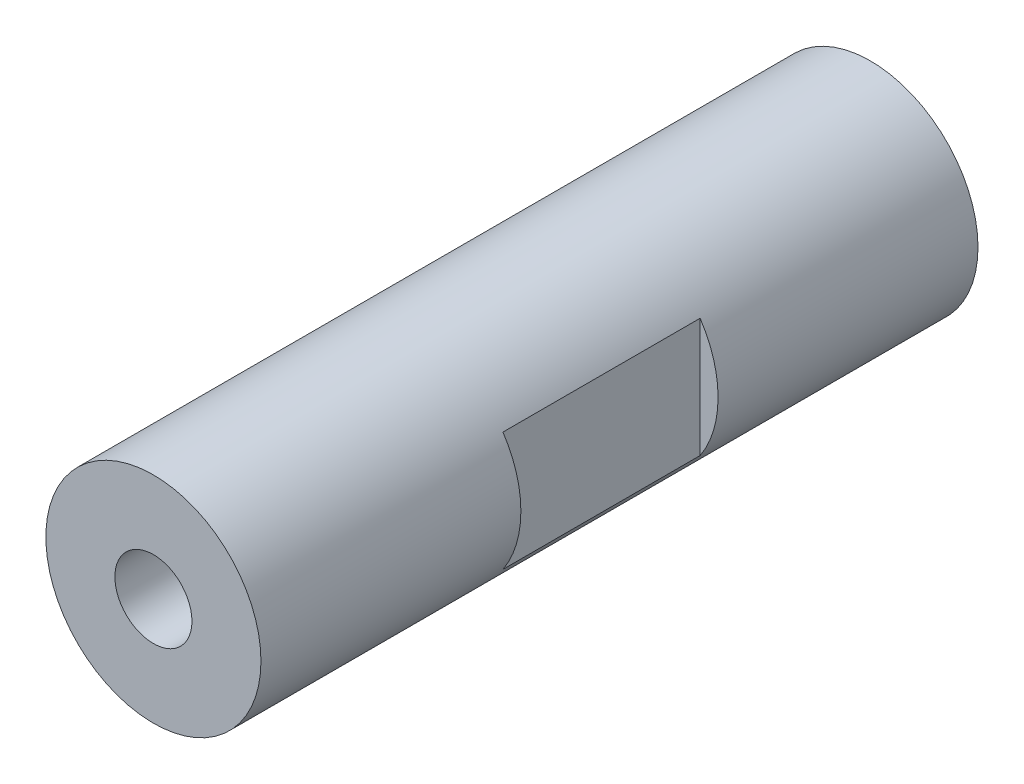
ISO-10303-21;
HEADER;
FILE_DESCRIPTION(('STEP AP214'),'2;1');
FILE_NAME('part.step','',(''),(''),'','','');
FILE_SCHEMA(('AUTOMOTIVE_DESIGN { 1 0 10303 214 1 1 1 1 }'));
ENDSEC;
DATA;
#1=APPLICATION_CONTEXT('core data for automotive mechanical design processes');
#2=APPLICATION_PROTOCOL_DEFINITION('international standard','automotive_design',2000,#1);
#3=PRODUCT_CONTEXT('',#1,'mechanical');
#4=PRODUCT('Part','Part','',(#3));
#5=PRODUCT_RELATED_PRODUCT_CATEGORY('part','',(#4));
#6=PRODUCT_DEFINITION_FORMATION('','',#4);
#7=PRODUCT_DEFINITION_CONTEXT('part definition',#1,'design');
#8=PRODUCT_DEFINITION('design','',#6,#7);
#9=PRODUCT_DEFINITION_SHAPE('','',#8);
#10=(LENGTH_UNIT() NAMED_UNIT(*) SI_UNIT(.MILLI.,.METRE.));
#11=(NAMED_UNIT(*) PLANE_ANGLE_UNIT() SI_UNIT($,.RADIAN.));
#12=(NAMED_UNIT(*) SI_UNIT($,.STERADIAN.) SOLID_ANGLE_UNIT());
#13=UNCERTAINTY_MEASURE_WITH_UNIT(LENGTH_MEASURE(1.E-05),#10,'distance_accuracy_value','');
#14=(GEOMETRIC_REPRESENTATION_CONTEXT(3) GLOBAL_UNCERTAINTY_ASSIGNED_CONTEXT((#13)) GLOBAL_UNIT_ASSIGNED_CONTEXT((#10,
#11,#12)) REPRESENTATION_CONTEXT('',''));
#15=CARTESIAN_POINT('',(0.,0.,0.));
#16=DIRECTION('',(0.,0.,1.));
#17=DIRECTION('',(1.,0.,0.));
#18=AXIS2_PLACEMENT_3D('',#15,#16,#17);
#19=CARTESIAN_POINT('',(0.,0.,40.));
#20=DIRECTION('',(0.,0.,1.));
#21=DIRECTION('',(1.,0.,0.));
#22=AXIS2_PLACEMENT_3D('',#19,#20,#21);
#23=PLANE('',#22);
#24=CARTESIAN_POINT('',(0.,0.,40.));
#25=DIRECTION('',(0.,0.,1.));
#26=DIRECTION('',(1.,0.,0.));
#27=AXIS2_PLACEMENT_3D('',#24,#25,#26);
#28=CIRCLE('',#27,6.);
#29=CARTESIAN_POINT('',(6.,0.,40.));
#30=VERTEX_POINT('',#29);
#31=EDGE_CURVE('E79',#30,#30,#28,.T.);
#32=ORIENTED_EDGE('',*,*,#31,.T.);
#33=EDGE_LOOP('',(#32));
#34=FACE_BOUND('',#33,.T.);
#35=CARTESIAN_POINT('',(0.,0.,40.));
#36=DIRECTION('',(0.,0.,1.));
#37=DIRECTION('',(1.,0.,0.));
#38=AXIS2_PLACEMENT_3D('',#35,#36,#37);
#39=CIRCLE('',#38,2.15);
#40=CARTESIAN_POINT('',(2.15,0.,40.));
#41=VERTEX_POINT('',#40);
#42=EDGE_CURVE('E112',#41,#41,#39,.T.);
#43=ORIENTED_EDGE('',*,*,#42,.F.);
#44=EDGE_LOOP('',(#43));
#45=FACE_BOUND('',#44,.T.);
#46=ADVANCED_FACE('F35',(#34,#45),#23,.T.);
#47=CARTESIAN_POINT('',(0.,0.,0.));
#48=DIRECTION('',(0.,0.,1.));
#49=DIRECTION('',(1.,0.,0.));
#50=AXIS2_PLACEMENT_3D('',#47,#48,#49);
#51=PLANE('',#50);
#52=CARTESIAN_POINT('',(0.,0.,0.));
#53=DIRECTION('',(0.,0.,1.));
#54=DIRECTION('',(1.,0.,0.));
#55=AXIS2_PLACEMENT_3D('',#52,#53,#54);
#56=CIRCLE('',#55,6.);
#57=CARTESIAN_POINT('',(6.,0.,0.));
#58=VERTEX_POINT('',#57);
#59=EDGE_CURVE('E118',#58,#58,#56,.T.);
#60=ORIENTED_EDGE('',*,*,#59,.F.);
#61=EDGE_LOOP('',(#60));
#62=FACE_BOUND('',#61,.T.);
#63=CARTESIAN_POINT('',(0.,0.,0.));
#64=DIRECTION('',(0.,0.,1.));
#65=DIRECTION('',(1.,0.,0.));
#66=AXIS2_PLACEMENT_3D('',#63,#64,#65);
#67=CIRCLE('',#66,2.15);
#68=CARTESIAN_POINT('',(2.15,0.,0.));
#69=VERTEX_POINT('',#68);
#70=EDGE_CURVE('E109',#69,#69,#67,.T.);
#71=ORIENTED_EDGE('',*,*,#70,.T.);
#72=EDGE_LOOP('',(#71));
#73=FACE_BOUND('',#72,.T.);
#74=ADVANCED_FACE('F126',(#62,#73),#51,.F.);
#75=CARTESIAN_POINT('',(0.,0.,40.));
#76=DIRECTION('',(0.,0.,-1.));
#77=DIRECTION('',(-1.,0.,0.));
#78=AXIS2_PLACEMENT_3D('',#75,#76,#77);
#79=CYLINDRICAL_SURFACE('',#78,6.);
#80=CARTESIAN_POINT('',(0.,0.,14.5));
#81=DIRECTION('',(0.,0.,-1.));
#82=DIRECTION('',(-1.,0.,0.));
#83=AXIS2_PLACEMENT_3D('',#80,#81,#82);
#84=CIRCLE('',#83,6.);
#85=CARTESIAN_POINT('',(-5.,-3.3166247903554,14.5));
#86=VERTEX_POINT('',#85);
#87=CARTESIAN_POINT('',(-5.,3.3166247903554,14.5));
#88=VERTEX_POINT('',#87);
#89=EDGE_CURVE('E11',#86,#88,#84,.T.);
#90=ORIENTED_EDGE('',*,*,#89,.T.);
#91=DIRECTION('',(0.,0.,-1.));
#92=VECTOR('',#91,1.);
#93=CARTESIAN_POINT('',(-5.,3.3166247903554,40.));
#94=LINE('',#93,#92);
#95=CARTESIAN_POINT('',(-5.,3.3166247903554,25.5));
#96=VERTEX_POINT('',#95);
#97=EDGE_CURVE('E98',#88,#96,#94,.F.);
#98=ORIENTED_EDGE('',*,*,#97,.T.);
#99=CARTESIAN_POINT('',(0.,0.,25.5));
#100=DIRECTION('',(0.,0.,1.));
#101=DIRECTION('',(1.,0.,0.));
#102=AXIS2_PLACEMENT_3D('',#99,#100,#101);
#103=CIRCLE('',#102,6.);
#104=CARTESIAN_POINT('',(-5.,-3.3166247903554,25.5));
#105=VERTEX_POINT('',#104);
#106=EDGE_CURVE('E92',#96,#105,#103,.T.);
#107=ORIENTED_EDGE('',*,*,#106,.T.);
#108=DIRECTION('',(0.,0.,-1.));
#109=VECTOR('',#108,1.);
#110=CARTESIAN_POINT('',(-5.,-3.3166247903554,40.));
#111=LINE('',#110,#109);
#112=EDGE_CURVE('E43',#105,#86,#111,.T.);
#113=ORIENTED_EDGE('',*,*,#112,.T.);
#114=EDGE_LOOP('',(#90,#98,#107,#113));
#115=FACE_BOUND('',#114,.T.);
#116=CARTESIAN_POINT('',(0.,0.,25.5));
#117=DIRECTION('',(0.,0.,1.));
#118=DIRECTION('',(1.,0.,0.));
#119=AXIS2_PLACEMENT_3D('',#116,#117,#118);
#120=CIRCLE('',#119,6.);
#121=CARTESIAN_POINT('',(5.,-3.31662479035541,25.5));
#122=VERTEX_POINT('',#121);
#123=CARTESIAN_POINT('',(5.,3.3166247903554,25.5));
#124=VERTEX_POINT('',#123);
#125=EDGE_CURVE('E90',#122,#124,#120,.T.);
#126=ORIENTED_EDGE('',*,*,#125,.T.);
#127=DIRECTION('',(0.,0.,-1.));
#128=VECTOR('',#127,1.);
#129=CARTESIAN_POINT('',(5.,3.31662479035541,40.));
#130=LINE('',#129,#128);
#131=CARTESIAN_POINT('',(5.,3.3166247903554,14.5));
#132=VERTEX_POINT('',#131);
#133=EDGE_CURVE('E85',#124,#132,#130,.T.);
#134=ORIENTED_EDGE('',*,*,#133,.T.);
#135=CARTESIAN_POINT('',(0.,0.,14.5));
#136=DIRECTION('',(0.,0.,-1.));
#137=DIRECTION('',(-1.,0.,0.));
#138=AXIS2_PLACEMENT_3D('',#135,#136,#137);
#139=CIRCLE('',#138,6.);
#140=CARTESIAN_POINT('',(5.,-3.3166247903554,14.5));
#141=VERTEX_POINT('',#140);
#142=EDGE_CURVE('E73',#132,#141,#139,.T.);
#143=ORIENTED_EDGE('',*,*,#142,.T.);
#144=DIRECTION('',(0.,0.,-1.));
#145=VECTOR('',#144,1.);
#146=CARTESIAN_POINT('',(5.,-3.31662479035541,40.));
#147=LINE('',#146,#145);
#148=EDGE_CURVE('E78',#141,#122,#147,.F.);
#149=ORIENTED_EDGE('',*,*,#148,.T.);
#150=EDGE_LOOP('',(#126,#134,#143,#149));
#151=FACE_BOUND('',#150,.T.);
#152=ORIENTED_EDGE('',*,*,#31,.F.);
#153=EDGE_LOOP('',(#152));
#154=FACE_BOUND('',#153,.T.);
#155=ORIENTED_EDGE('',*,*,#59,.T.);
#156=EDGE_LOOP('',(#155));
#157=FACE_BOUND('',#156,.T.);
#158=ADVANCED_FACE('F37',(#115,#151,#154,#157),#79,.T.);
#159=CARTESIAN_POINT('',(0.,0.,40.));
#160=DIRECTION('',(0.,0.,-1.));
#161=DIRECTION('',(-1.,0.,0.));
#162=AXIS2_PLACEMENT_3D('',#159,#160,#161);
#163=CYLINDRICAL_SURFACE('',#162,2.15);
#164=ORIENTED_EDGE('',*,*,#42,.T.);
#165=EDGE_LOOP('',(#164));
#166=FACE_BOUND('',#165,.T.);
#167=ORIENTED_EDGE('',*,*,#70,.F.);
#168=EDGE_LOOP('',(#167));
#169=FACE_BOUND('',#168,.T.);
#170=ADVANCED_FACE('F131',(#166,#169),#163,.F.);
#171=CARTESIAN_POINT('',(6.,-6.,25.5));
#172=DIRECTION('',(0.,0.,1.));
#173=DIRECTION('',(1.,0.,0.));
#174=AXIS2_PLACEMENT_3D('',#171,#172,#173);
#175=PLANE('',#174);
#176=ORIENTED_EDGE('',*,*,#125,.F.);
#177=DIRECTION('',(0.,1.,0.));
#178=VECTOR('',#177,1.);
#179=CARTESIAN_POINT('',(5.,-6.,25.5));
#180=LINE('',#179,#178);
#181=EDGE_CURVE('E87',#122,#124,#180,.T.);
#182=ORIENTED_EDGE('',*,*,#181,.T.);
#183=EDGE_LOOP('',(#176,#182));
#184=FACE_BOUND('',#183,.T.);
#185=ADVANCED_FACE('F133',(#184),#175,.F.);
#186=CARTESIAN_POINT('',(5.,-6.,14.5));
#187=DIRECTION('',(-1.,0.,0.));
#188=DIRECTION('',(0.,0.,1.));
#189=AXIS2_PLACEMENT_3D('',#186,#187,#188);
#190=PLANE('',#189);
#191=ORIENTED_EDGE('',*,*,#181,.F.);
#192=ORIENTED_EDGE('',*,*,#148,.F.);
#193=DIRECTION('',(0.,1.,0.));
#194=VECTOR('',#193,1.);
#195=CARTESIAN_POINT('',(5.,-6.,14.5));
#196=LINE('',#195,#194);
#197=EDGE_CURVE('E56',#141,#132,#196,.T.);
#198=ORIENTED_EDGE('',*,*,#197,.T.);
#199=ORIENTED_EDGE('',*,*,#133,.F.);
#200=EDGE_LOOP('',(#191,#192,#198,#199));
#201=FACE_BOUND('',#200,.T.);
#202=ADVANCED_FACE('F84',(#201),#190,.F.);
#203=CARTESIAN_POINT('',(6.,-6.,14.5));
#204=DIRECTION('',(0.,0.,-1.));
#205=DIRECTION('',(-1.,0.,0.));
#206=AXIS2_PLACEMENT_3D('',#203,#204,#205);
#207=PLANE('',#206);
#208=ORIENTED_EDGE('',*,*,#197,.F.);
#209=ORIENTED_EDGE('',*,*,#142,.F.);
#210=EDGE_LOOP('',(#208,#209));
#211=FACE_BOUND('',#210,.T.);
#212=ADVANCED_FACE('F74',(#211),#207,.F.);
#213=CARTESIAN_POINT('',(-6.,-6.,14.5));
#214=DIRECTION('',(0.,0.,-1.));
#215=DIRECTION('',(-1.,0.,0.));
#216=AXIS2_PLACEMENT_3D('',#213,#214,#215);
#217=PLANE('',#216);
#218=ORIENTED_EDGE('',*,*,#89,.F.);
#219=DIRECTION('',(0.,1.,0.));
#220=VECTOR('',#219,1.);
#221=CARTESIAN_POINT('',(-5.,-6.,14.5));
#222=LINE('',#221,#220);
#223=EDGE_CURVE('E107',#86,#88,#222,.T.);
#224=ORIENTED_EDGE('',*,*,#223,.T.);
#225=EDGE_LOOP('',(#218,#224));
#226=FACE_BOUND('',#225,.T.);
#227=ADVANCED_FACE('F184',(#226),#217,.F.);
#228=CARTESIAN_POINT('',(-5.,-6.,14.5));
#229=DIRECTION('',(1.,0.,0.));
#230=DIRECTION('',(0.,0.,-1.));
#231=AXIS2_PLACEMENT_3D('',#228,#229,#230);
#232=PLANE('',#231);
#233=DIRECTION('',(0.,1.,0.));
#234=VECTOR('',#233,1.);
#235=CARTESIAN_POINT('',(-5.,-6.,25.5));
#236=LINE('',#235,#234);
#237=EDGE_CURVE('E49',#105,#96,#236,.T.);
#238=ORIENTED_EDGE('',*,*,#237,.T.);
#239=ORIENTED_EDGE('',*,*,#97,.F.);
#240=ORIENTED_EDGE('',*,*,#223,.F.);
#241=ORIENTED_EDGE('',*,*,#112,.F.);
#242=EDGE_LOOP('',(#238,#239,#240,#241));
#243=FACE_BOUND('',#242,.T.);
#244=ADVANCED_FACE('F105',(#243),#232,.F.);
#245=CARTESIAN_POINT('',(-6.,-6.,25.5));
#246=DIRECTION('',(0.,0.,1.));
#247=DIRECTION('',(1.,0.,0.));
#248=AXIS2_PLACEMENT_3D('',#245,#246,#247);
#249=PLANE('',#248);
#250=ORIENTED_EDGE('',*,*,#237,.F.);
#251=ORIENTED_EDGE('',*,*,#106,.F.);
#252=EDGE_LOOP('',(#250,#251));
#253=FACE_BOUND('',#252,.T.);
#254=ADVANCED_FACE('F200',(#253),#249,.F.);
#255=CLOSED_SHELL('',(#46,#74,#158,#170,#185,#202,#212,#227,#244,#254));
#256=MANIFOLD_SOLID_BREP('B2',#255);
#257=ADVANCED_BREP_SHAPE_REPRESENTATION('',(#18,#256),#14);
#258=SHAPE_DEFINITION_REPRESENTATION(#9,#257);
ENDSEC;
END-ISO-10303-21;
